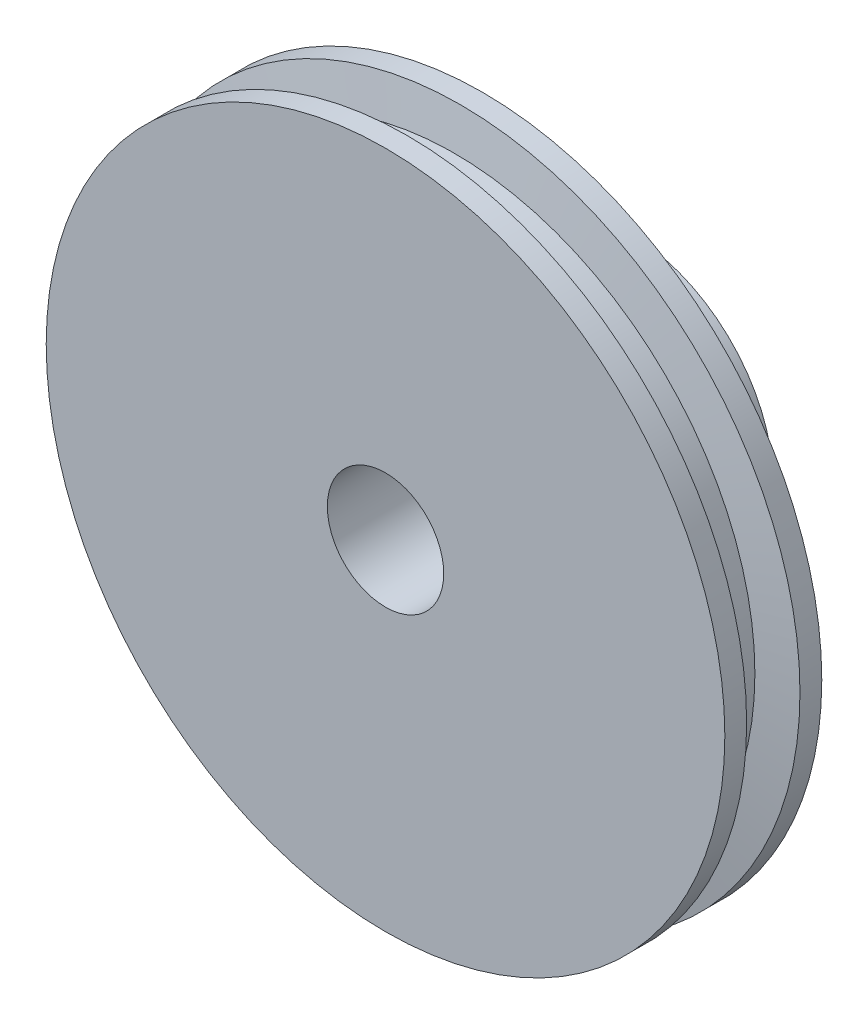
ISO-10303-21;
HEADER;
FILE_DESCRIPTION(('STEP AP214'),'2;1');
FILE_NAME('part.step','',(''),(''),'','','');
FILE_SCHEMA(('AUTOMOTIVE_DESIGN { 1 0 10303 214 1 1 1 1 }'));
ENDSEC;
DATA;
#1=APPLICATION_CONTEXT('core data for automotive mechanical design processes');
#2=APPLICATION_PROTOCOL_DEFINITION('international standard','automotive_design',2000,#1);
#3=PRODUCT_CONTEXT('',#1,'mechanical');
#4=PRODUCT('Part','Part','',(#3));
#5=PRODUCT_RELATED_PRODUCT_CATEGORY('part','',(#4));
#6=PRODUCT_DEFINITION_FORMATION('','',#4);
#7=PRODUCT_DEFINITION_CONTEXT('part definition',#1,'design');
#8=PRODUCT_DEFINITION('design','',#6,#7);
#9=PRODUCT_DEFINITION_SHAPE('','',#8);
#10=(LENGTH_UNIT() NAMED_UNIT(*) SI_UNIT(.MILLI.,.METRE.));
#11=(NAMED_UNIT(*) PLANE_ANGLE_UNIT() SI_UNIT($,.RADIAN.));
#12=(NAMED_UNIT(*) SI_UNIT($,.STERADIAN.) SOLID_ANGLE_UNIT());
#13=UNCERTAINTY_MEASURE_WITH_UNIT(LENGTH_MEASURE(1.E-05),#10,'distance_accuracy_value','');
#14=(GEOMETRIC_REPRESENTATION_CONTEXT(3) GLOBAL_UNCERTAINTY_ASSIGNED_CONTEXT((#13)) GLOBAL_UNIT_ASSIGNED_CONTEXT((#10,
#11,#12)) REPRESENTATION_CONTEXT('',''));
#15=CARTESIAN_POINT('',(0.,0.,0.));
#16=DIRECTION('',(0.,0.,1.));
#17=DIRECTION('',(1.,0.,0.));
#18=AXIS2_PLACEMENT_3D('',#15,#16,#17);
#19=CARTESIAN_POINT('',(0.,0.,10.));
#20=DIRECTION('',(0.,0.,-1.));
#21=DIRECTION('',(-1.,0.,0.));
#22=AXIS2_PLACEMENT_3D('',#19,#20,#21);
#23=CYLINDRICAL_SURFACE('',#22,35.);
#24=CARTESIAN_POINT('',(0.,0.,0.));
#25=DIRECTION('',(0.,0.,1.));
#26=DIRECTION('',(1.,0.,0.));
#27=AXIS2_PLACEMENT_3D('',#24,#25,#26);
#28=CIRCLE('',#27,35.);
#29=CARTESIAN_POINT('',(35.,0.,0.));
#30=VERTEX_POINT('',#29);
#31=EDGE_CURVE('E52',#30,#30,#28,.T.);
#32=ORIENTED_EDGE('',*,*,#31,.T.);
#33=EDGE_LOOP('',(#32));
#34=FACE_BOUND('',#33,.T.);
#35=CARTESIAN_POINT('',(0.,0.,2.25));
#36=DIRECTION('',(0.,0.,1.));
#37=DIRECTION('',(1.,0.,0.));
#38=AXIS2_PLACEMENT_3D('',#35,#36,#37);
#39=CIRCLE('',#38,35.);
#40=CARTESIAN_POINT('',(35.,0.,2.25));
#41=VERTEX_POINT('',#40);
#42=EDGE_CURVE('E84',#41,#41,#39,.T.);
#43=ORIENTED_EDGE('',*,*,#42,.F.);
#44=EDGE_LOOP('',(#43));
#45=FACE_BOUND('',#44,.T.);
#46=ADVANCED_FACE('F39',(#34,#45),#23,.T.);
#47=CARTESIAN_POINT('',(0.,0.,10.));
#48=DIRECTION('',(0.,0.,1.));
#49=DIRECTION('',(1.,0.,0.));
#50=AXIS2_PLACEMENT_3D('',#47,#48,#49);
#51=CIRCLE('',#50,35.);
#52=CARTESIAN_POINT('',(35.,0.,10.));
#53=VERTEX_POINT('',#52);
#54=EDGE_CURVE('E46',#53,#53,#51,.T.);
#55=ORIENTED_EDGE('',*,*,#54,.F.);
#56=EDGE_LOOP('',(#55));
#57=FACE_BOUND('',#56,.T.);
#58=CARTESIAN_POINT('',(0.,0.,7.75));
#59=DIRECTION('',(0.,0.,1.));
#60=DIRECTION('',(1.,0.,0.));
#61=AXIS2_PLACEMENT_3D('',#58,#59,#60);
#62=CIRCLE('',#61,35.);
#63=CARTESIAN_POINT('',(35.,0.,7.75));
#64=VERTEX_POINT('',#63);
#65=EDGE_CURVE('E80',#64,#64,#62,.T.);
#66=ORIENTED_EDGE('',*,*,#65,.T.);
#67=EDGE_LOOP('',(#66));
#68=FACE_BOUND('',#67,.T.);
#69=ADVANCED_FACE('F118',(#57,#68),#23,.T.);
#70=CARTESIAN_POINT('',(0.,0.,0.));
#71=DIRECTION('',(0.,0.,1.));
#72=DIRECTION('',(1.,0.,0.));
#73=AXIS2_PLACEMENT_3D('',#70,#71,#72);
#74=PLANE('',#73);
#75=ORIENTED_EDGE('',*,*,#31,.F.);
#76=EDGE_LOOP('',(#75));
#77=FACE_BOUND('',#76,.T.);
#78=CARTESIAN_POINT('',(0.,0.,0.));
#79=DIRECTION('',(0.,0.,1.));
#80=DIRECTION('',(1.,0.,0.));
#81=AXIS2_PLACEMENT_3D('',#78,#79,#80);
#82=CIRCLE('',#81,15.);
#83=CARTESIAN_POINT('',(15.,0.,0.));
#84=VERTEX_POINT('',#83);
#85=EDGE_CURVE('E10',#84,#84,#82,.F.);
#86=ORIENTED_EDGE('',*,*,#85,.F.);
#87=EDGE_LOOP('',(#86));
#88=FACE_BOUND('',#87,.T.);
#89=ADVANCED_FACE('F123',(#77,#88),#74,.F.);
#90=CARTESIAN_POINT('',(0.,0.,10.));
#91=DIRECTION('',(0.,0.,1.));
#92=DIRECTION('',(1.,0.,0.));
#93=AXIS2_PLACEMENT_3D('',#90,#91,#92);
#94=PLANE('',#93);
#95=ORIENTED_EDGE('',*,*,#54,.T.);
#96=EDGE_LOOP('',(#95));
#97=FACE_BOUND('',#96,.T.);
#98=CARTESIAN_POINT('',(0.,0.,10.));
#99=DIRECTION('',(0.,0.,1.));
#100=DIRECTION('',(1.,0.,0.));
#101=AXIS2_PLACEMENT_3D('',#98,#99,#100);
#102=CIRCLE('',#101,6.);
#103=CARTESIAN_POINT('',(6.,0.,10.));
#104=VERTEX_POINT('',#103);
#105=EDGE_CURVE('E59',#104,#104,#102,.T.);
#106=ORIENTED_EDGE('',*,*,#105,.F.);
#107=EDGE_LOOP('',(#106));
#108=FACE_BOUND('',#107,.T.);
#109=ADVANCED_FACE('F156',(#97,#108),#94,.T.);
#110=CARTESIAN_POINT('',(0.,0.,10.));
#111=DIRECTION('',(0.,0.,-1.));
#112=DIRECTION('',(-1.,0.,0.));
#113=AXIS2_PLACEMENT_3D('',#110,#111,#112);
#114=CYLINDRICAL_SURFACE('',#113,6.);
#115=CARTESIAN_POINT('',(0.,6.,-5.));
#116=CARTESIAN_POINT('',(-0.13390391816379,5.99999628290907,-5.00000471213959));
#117=CARTESIAN_POINT('',(-0.268039524991423,5.99546656821164,-5.01082131560053));
#118=CARTESIAN_POINT('',(-0.532498019991112,5.97780115788617,-5.05368073809364));
#119=CARTESIAN_POINT('',(-0.662810029808669,5.96464300599791,-5.08577894678153));
#120=CARTESIAN_POINT('',(-0.915376593299222,5.93112629106012,-5.1698214880593));
#121=CARTESIAN_POINT('',(-1.03765681434384,5.91079213642029,-5.2216985923231));
#122=CARTESIAN_POINT('',(-1.27165974779733,5.8649055925345,-5.34354583302187));
#123=CARTESIAN_POINT('',(-1.38338564416287,5.83935478441347,-5.41351048897477));
#124=CARTESIAN_POINT('',(-1.59889674004597,5.78415660619864,-5.57325791180755));
#125=CARTESIAN_POINT('',(-1.70208251703041,5.75437507703433,-5.66380260325171));
#126=CARTESIAN_POINT('',(-1.89231966019709,5.69465427085229,-5.86052868390046));
#127=CARTESIAN_POINT('',(-1.9793625312399,5.66471491925558,-5.96671825371509));
#128=CARTESIAN_POINT('',(-2.13907474876483,5.60642043928224,-6.19805355101054));
#129=CARTESIAN_POINT('',(-2.21082616169409,5.57821573827599,-6.32387489575144));
#130=CARTESIAN_POINT('',(-2.33187881316099,5.52871144633223,-6.58714651694295));
#131=CARTESIAN_POINT('',(-2.38119161708798,5.50740829980501,-6.72459075925711));
#132=CARTESIAN_POINT('',(-2.45349196589845,5.47557110795537,-7.00030738326152));
#133=CARTESIAN_POINT('',(-2.47763315746,5.46456775308952,-7.13822096671102));
#134=CARTESIAN_POINT('',(-2.50250419944797,5.45322652433634,-7.41654658544639));
#135=CARTESIAN_POINT('',(-2.50324696111169,5.45288276849133,-7.55695720007038));
#136=CARTESIAN_POINT('',(-2.48216900725154,5.46250239122986,-7.82480012085242));
#137=CARTESIAN_POINT('',(-2.46207362224013,5.47167765447589,-7.95240219312424));
#138=CARTESIAN_POINT('',(-2.40278382032141,5.4979696554725,-8.20222418200546));
#139=CARTESIAN_POINT('',(-2.36358574574512,5.51508791407035,-8.32444306298481));
#140=CARTESIAN_POINT('',(-2.26643917454979,5.55572369545608,-8.56311540598159));
#141=CARTESIAN_POINT('',(-2.20810943078428,5.57936963898298,-8.67939084182641));
#142=CARTESIAN_POINT('',(-2.07462485161168,5.63036662282147,-8.90095546776063));
#143=CARTESIAN_POINT('',(-1.99946338103921,5.65771912259552,-9.00624030122713));
#144=CARTESIAN_POINT('',(-1.82699193108754,5.71585953755966,-9.21219991746557));
#145=CARTESIAN_POINT('',(-1.72834696641501,5.74674242808948,-9.31173313477084));
#146=CARTESIAN_POINT('',(-1.51545918210305,5.80651346225057,-9.49322700591838));
#147=CARTESIAN_POINT('',(-1.40121271889692,5.83540113754019,-9.57518354338436));
#148=CARTESIAN_POINT('',(-1.15689589738674,5.88876567112947,-9.72087164723252));
#149=CARTESIAN_POINT('',(-1.02652116489535,5.91312533086667,-9.78413889030135));
#150=CARTESIAN_POINT('',(-0.755704805053663,5.95378962829607,-9.88744227920651));
#151=CARTESIAN_POINT('',(-0.615268789590069,5.970098716916,-9.92749126388763));
#152=CARTESIAN_POINT('',(-0.337856226692455,5.9919928237277,-9.98083198425327));
#153=CARTESIAN_POINT('',(-0.201222570557278,5.9981908209425,-9.99565571488749));
#154=CARTESIAN_POINT('',(0.0727093109921774,6.00112100737489,-10.0026924472282));
#155=CARTESIAN_POINT('',(0.21000733430527,5.99785591423878,-9.99491194050399));
#156=CARTESIAN_POINT('',(0.47419648468287,5.9826243531388,-9.95805783038786));
#157=CARTESIAN_POINT('',(0.601265933278774,5.97109774567979,-9.9300600918056));
#158=CARTESIAN_POINT('',(0.848765497942177,5.94097213544829,-9.85506361091842));
#159=CARTESIAN_POINT('',(0.969194773036712,5.92237223919408,-9.80806246809938));
#160=CARTESIAN_POINT('',(1.20421799973828,5.87916541290331,-9.69485804857577));
#161=CARTESIAN_POINT('',(1.31851447371068,5.85438982938561,-9.62810363370795));
#162=CARTESIAN_POINT('',(1.53469243246282,5.80147609158182,-9.47789324441658));
#163=CARTESIAN_POINT('',(1.63656870520375,5.77333653537473,-9.39443029694135));
#164=CARTESIAN_POINT('',(1.83266686054867,5.71424175790868,-9.20619353345529));
#165=CARTESIAN_POINT('',(1.92582139596022,5.68322903182029,-9.10032299402789));
#166=CARTESIAN_POINT('',(2.09333969221046,5.6236867353604,-8.87395744812879));
#167=CARTESIAN_POINT('',(2.16769918571026,5.59515772986988,-8.75345912965498));
#168=CARTESIAN_POINT('',(2.29631920417609,5.54362772487864,-8.49877164939642));
#169=CARTESIAN_POINT('',(2.3502783647545,5.52071125109803,-8.36441192897625));
#170=CARTESIAN_POINT('',(2.43434827902352,5.48416711318335,-8.08725881237388));
#171=CARTESIAN_POINT('',(2.46447869724417,5.47053179113073,-7.94447247501124));
#172=CARTESIAN_POINT('',(2.49808160700531,5.4552632907308,-7.66636260162194));
#173=CARTESIAN_POINT('',(2.50342760836083,5.45278701929114,-7.53131067548805));
#174=CARTESIAN_POINT('',(2.49231151038,5.45787706027259,-7.26231427764452));
#175=CARTESIAN_POINT('',(2.47585275892879,5.46544183100008,-7.1283696390999));
#176=CARTESIAN_POINT('',(2.42316809595844,5.48899102586044,-6.87181450532224));
#177=CARTESIAN_POINT('',(2.38789807270202,5.50456709625454,-6.74896665402247));
#178=CARTESIAN_POINT('',(2.29952656276962,5.54206362465905,-6.51090395633603));
#179=CARTESIAN_POINT('',(2.24642006560088,5.56398586515029,-6.39569126566399));
#180=CARTESIAN_POINT('',(2.1202057237392,5.61333908853254,-6.16860821185295));
#181=CARTESIAN_POINT('',(2.04608723750135,5.64102204404079,-6.05735535405219));
#182=CARTESIAN_POINT('',(1.88136812596238,5.69807379131314,-5.84827970688487));
#183=CARTESIAN_POINT('',(1.79076178563715,5.72744316520044,-5.75046159496759));
#184=CARTESIAN_POINT('',(1.58780416898837,5.78712781593092,-5.56370269438247));
#185=CARTESIAN_POINT('',(1.47434977868813,5.8173561917501,-5.47592735717221));
#186=CARTESIAN_POINT('',(1.23319985958042,5.87320303099822,-5.3206008699579));
#187=CARTESIAN_POINT('',(1.10549787741689,5.89881939160172,-5.25305893600317));
#188=CARTESIAN_POINT('',(0.84146521342219,5.94218308378896,-5.1415811295484));
#189=CARTESIAN_POINT('',(0.705312056415863,5.96005349044659,-5.09727350570993));
#190=CARTESIAN_POINT('',(0.426816782070265,5.9864223497589,-5.03258431247041));
#191=CARTESIAN_POINT('',(0.284495506121987,5.99495014042422,-5.01212783179418));
#192=CARTESIAN_POINT('',(0.118052512349435,5.99888566614292,-5.00267615821379));
#193=CARTESIAN_POINT('',(0.0944569348794004,5.99930292614998,-5.00167339749699));
#194=CARTESIAN_POINT('',(0.0472433090693345,5.99986042138656,-5.00033490174323));
#195=CARTESIAN_POINT('',(0.0236252606651497,6.0000006558228,-4.99999916861637));
#196=CARTESIAN_POINT('',(0.,6.,-5.));
#197=B_SPLINE_CURVE_WITH_KNOTS('',3,(#115,#116,#117,#118,#119,#120,#121,#122,#123,#124,#125,
#126,#127,#128,#129,#130,#131,#132,#133,#134,#135,#136,#137,#138,#139,#140,#141,#142,#143,#144,
#145,#146,#147,#148,#149,#150,#151,#152,#153,#154,#155,#156,#157,#158,#159,#160,#161,#162,#163,
#164,#165,#166,#167,#168,#169,#170,#171,#172,#173,#174,#175,#176,#177,#178,#179,#180,#181,#182,
#183,#184,#185,#186,#187,#188,#189,#190,#191,#192,#193,#194,#195,#196),.UNSPECIFIED.,.T.,.F.,(4,
2,2,2,2,2,2,2,2,2,2,2,2,2,2,2,2,2,2,2,2,2,2,2,2,2,2,2,2,2,2,2,2,2,2,2,2,2,2,2,4),(0.,
0.401613837767876,0.804277081257391,1.2055837038126,1.60676887370594,2.02635872577614,
2.4461687626293,2.8866344907825,3.32687293461175,3.74590546275114,4.16470676498091,
4.55140314405112,4.93817359454424,5.33317426117428,5.72833091434412,6.15688282255791,
6.58553498629174,7.02408110121625,7.46238448436592,7.872968867865,8.28343534986342,
8.67353179471441,9.06367753203568,9.4659427054432,9.8683761093899,10.2995697605859,
10.7308612248068,11.1682957671904,11.6053689414916,12.0087975511928,12.4121642259507,
12.7967529992952,13.1814498990122,13.5892778679488,13.9972474685189,14.4349307000978,
14.8728129885716,15.3034571163877,15.7327450093864,15.8036033125921,15.8744618187069),.UNSPECIFIED.);
#198=CARTESIAN_POINT('',(0.,6.,-5.));
#199=VERTEX_POINT('',#198);
#200=EDGE_CURVE('E97',#199,#199,#197,.T.);
#201=ORIENTED_EDGE('',*,*,#200,.F.);
#202=EDGE_LOOP('',(#201));
#203=FACE_BOUND('',#202,.T.);
#204=ORIENTED_EDGE('',*,*,#105,.T.);
#205=EDGE_LOOP('',(#204));
#206=FACE_BOUND('',#205,.T.);
#207=CARTESIAN_POINT('',(0.,0.,-15.));
#208=DIRECTION('',(0.,0.,-1.));
#209=DIRECTION('',(-1.,0.,0.));
#210=AXIS2_PLACEMENT_3D('',#207,#208,#209);
#211=CIRCLE('',#210,6.);
#212=CARTESIAN_POINT('',(-6.,0.,-15.));
#213=VERTEX_POINT('',#212);
#214=EDGE_CURVE('E68',#213,#213,#211,.T.);
#215=ORIENTED_EDGE('',*,*,#214,.T.);
#216=EDGE_LOOP('',(#215));
#217=FACE_BOUND('',#216,.T.);
#218=ADVANCED_FACE('F149',(#203,#206,#217),#114,.F.);
#219=CARTESIAN_POINT('',(0.,0.,-15.));
#220=DIRECTION('',(0.,0.,-1.));
#221=DIRECTION('',(-1.,0.,0.));
#222=AXIS2_PLACEMENT_3D('',#219,#220,#221);
#223=PLANE('',#222);
#224=CARTESIAN_POINT('',(0.,0.,-15.));
#225=DIRECTION('',(0.,0.,-1.));
#226=DIRECTION('',(-1.,0.,0.));
#227=AXIS2_PLACEMENT_3D('',#224,#225,#226);
#228=CIRCLE('',#227,15.);
#229=CARTESIAN_POINT('',(-15.,0.,-15.));
#230=VERTEX_POINT('',#229);
#231=EDGE_CURVE('E64',#230,#230,#228,.T.);
#232=ORIENTED_EDGE('',*,*,#231,.T.);
#233=EDGE_LOOP('',(#232));
#234=FACE_BOUND('',#233,.T.);
#235=ORIENTED_EDGE('',*,*,#214,.F.);
#236=EDGE_LOOP('',(#235));
#237=FACE_BOUND('',#236,.T.);
#238=ADVANCED_FACE('F146',(#234,#237),#223,.T.);
#239=CARTESIAN_POINT('',(0.,0.,-15.));
#240=DIRECTION('',(0.,0.,1.));
#241=DIRECTION('',(1.,0.,0.));
#242=AXIS2_PLACEMENT_3D('',#239,#240,#241);
#243=CYLINDRICAL_SURFACE('',#242,15.);
#244=CARTESIAN_POINT('',(0.,15.,-5.00000000000001));
#245=CARTESIAN_POINT('',(-0.139390904958214,14.9999976116882,-5.00000558894783));
#246=CARTESIAN_POINT('',(-0.27885788183882,14.9980367791303,-5.01169727496893));
#247=CARTESIAN_POINT('',(-0.553880221673041,14.9904034494139,-5.05813565876533));
#248=CARTESIAN_POINT('',(-0.689431867959244,14.9847275392389,-5.09290355691161));
#249=CARTESIAN_POINT('',(-0.95260474721264,14.9703006823645,-5.18441544859276));
#250=CARTESIAN_POINT('',(-1.0802323684319,14.9615522515919,-5.24114146564058));
#251=CARTESIAN_POINT('',(-1.32414184197794,14.9419422708207,-5.3749122920524));
#252=CARTESIAN_POINT('',(-1.44042498987859,14.9310809625443,-5.451954777483));
#253=CARTESIAN_POINT('',(-1.65947261429167,14.9083331745831,-5.62495508382047));
#254=CARTESIAN_POINT('',(-1.76211290353496,14.8964387181486,-5.72106911463614));
#255=CARTESIAN_POINT('',(-1.94988849865992,14.8730262687673,-5.92914796847282));
#256=CARTESIAN_POINT('',(-2.03502269939096,14.8615082996267,-6.04111379145662));
#257=CARTESIAN_POINT('',(-2.18586712560512,14.8400756575978,-6.27857096619706));
#258=CARTESIAN_POINT('',(-2.25145455286099,14.8301712909164,-6.40414133680476));
#259=CARTESIAN_POINT('',(-2.36055836541121,14.8131978979467,-6.66470956430063));
#260=CARTESIAN_POINT('',(-2.4040762415656,14.8061286801431,-6.79970678367763));
#261=CARTESIAN_POINT('',(-2.4674143777848,14.7957053684276,-7.07398027485654));
#262=CARTESIAN_POINT('',(-2.48744902913539,14.792317684857,-7.21320573650139));
#263=CARTESIAN_POINT('',(-2.50391672528987,14.7895393893665,-7.49308027688347));
#264=CARTESIAN_POINT('',(-2.50035144038899,14.7901484945721,-7.6337292541673));
#265=CARTESIAN_POINT('',(-2.46989509839614,14.7952642886356,-7.91092786127544));
#266=CARTESIAN_POINT('',(-2.44324488188976,14.7997307331892,-8.04750480354523));
#267=CARTESIAN_POINT('',(-2.36775314040344,14.8119949521101,-8.31422131782913));
#268=CARTESIAN_POINT('',(-2.31891085431973,14.8197928407327,-8.44436066888854));
#269=CARTESIAN_POINT('',(-2.2001772460939,14.837884793341,-8.69522882344091));
#270=CARTESIAN_POINT('',(-2.1301859138797,14.8481906710733,-8.81590940608122));
#271=CARTESIAN_POINT('',(-1.97121201755742,14.8701291841501,-9.04390440053838));
#272=CARTESIAN_POINT('',(-1.88222792065428,14.8817619265429,-9.15121773245493));
#273=CARTESIAN_POINT('',(-1.68648221215905,14.9052202787979,-9.35082608580734));
#274=CARTESIAN_POINT('',(-1.57951396387312,14.9170464923165,-9.44291851854008));
#275=CARTESIAN_POINT('',(-1.35153524898164,14.9394260139672,-9.60787776266533));
#276=CARTESIAN_POINT('',(-1.23052469190642,14.9499793138975,-9.68074445018322));
#277=CARTESIAN_POINT('',(-0.977705916166707,14.9686389289291,-9.80520222713627));
#278=CARTESIAN_POINT('',(-0.845888725564657,14.9767431840745,-9.85677541933125));
#279=CARTESIAN_POINT('',(-0.575298345602728,14.9895750301266,-9.93699421524597));
#280=CARTESIAN_POINT('',(-0.436525739179465,14.9943029035047,-9.96564173697371));
#281=CARTESIAN_POINT('',(-0.157709901301621,14.9998112984269,-9.99892135846112));
#282=CARTESIAN_POINT('',(-0.0177007371510091,15.0006375301278,-10.0038315718056));
#283=CARTESIAN_POINT('',(0.261139772889888,14.9983747442117,-9.99023865557187));
#284=CARTESIAN_POINT('',(0.399971163892038,14.9952858772412,-9.97173642686625));
#285=CARTESIAN_POINT('',(0.671656175546762,14.985568269382,-9.91207515066451));
#286=CARTESIAN_POINT('',(0.804540868385377,14.9789610480131,-9.87105379160986));
#287=CARTESIAN_POINT('',(1.06154688486044,14.9629446445536,-9.76766548180045));
#288=CARTESIAN_POINT('',(1.18566771590971,14.9535353051202,-9.70529733236472));
#289=CARTESIAN_POINT('',(1.42283068946895,14.9328451630241,-9.5603488753032));
#290=CARTESIAN_POINT('',(1.53576525093714,14.9215485588702,-9.47759484383274));
#291=CARTESIAN_POINT('',(1.74624358550268,14.898384673919,-9.29446268461493));
#292=CARTESIAN_POINT('',(1.84378623969658,14.8865173517155,-9.19408327672332));
#293=CARTESIAN_POINT('',(2.02174277965799,14.8634017523585,-8.97730245192857));
#294=CARTESIAN_POINT('',(2.10196876111371,14.8521611613711,-8.86074583448558));
#295=CARTESIAN_POINT('',(2.24170231029498,14.8317152977788,-8.61564703086146));
#296=CARTESIAN_POINT('',(2.30121053476981,14.8225099606602,-8.4871052247725));
#297=CARTESIAN_POINT('',(2.39753833147314,14.807234536977,-8.22221026718786));
#298=CARTESIAN_POINT('',(2.43445143254794,14.8011515431106,-8.08589190496951));
#299=CARTESIAN_POINT('',(2.48483545377827,14.7927771683526,-7.80887987077824));
#300=CARTESIAN_POINT('',(2.49830841194616,14.7904854578272,-7.66818658026795));
#301=CARTESIAN_POINT('',(2.50137286604734,14.7899673308401,-7.38829483403759));
#302=CARTESIAN_POINT('',(2.49126013612518,14.7916905650565,-7.24909962142471));
#303=CARTESIAN_POINT('',(2.44807983895684,14.7988978145373,-6.97442075194923));
#304=CARTESIAN_POINT('',(2.41501234611247,14.8043818176121,-6.83893708305813));
#305=CARTESIAN_POINT('',(2.32697448959489,14.8184735628172,-6.57564156270739));
#306=CARTESIAN_POINT('',(2.27202959060043,14.8270776721967,-6.44782098994398));
#307=CARTESIAN_POINT('',(2.1418270039159,14.8464436892221,-6.20316433080516));
#308=CARTESIAN_POINT('',(2.06656830874855,14.857205703884,-6.08632878962787));
#309=CARTESIAN_POINT('',(1.89681888437215,14.8798345404562,-5.86546441689225));
#310=CARTESIAN_POINT('',(1.80211056359364,14.891712955763,-5.76160398329973));
#311=CARTESIAN_POINT('',(1.59660903138022,14.9151437236084,-5.57114839552507));
#312=CARTESIAN_POINT('',(1.48581211291263,14.9266960002655,-5.48455723136184));
#313=CARTESIAN_POINT('',(1.25036916964028,14.9482652964222,-5.33055173180006));
#314=CARTESIAN_POINT('',(1.12563278753281,14.958271162531,-5.26327396068706));
#315=CARTESIAN_POINT('',(0.866513069378978,14.9755116760178,-5.15073051539009));
#316=CARTESIAN_POINT('',(0.732139494830007,14.9827490817748,-5.10544291892031));
#317=CARTESIAN_POINT('',(0.497703310045399,14.9920579083296,-5.04799472587334));
#318=CARTESIAN_POINT('',(0.399058830298446,14.9950202727336,-5.03002553038404));
#319=CARTESIAN_POINT('',(0.200289310319808,14.9989921598612,-5.00602626215526));
#320=CARTESIAN_POINT('',(0.100164295608494,15.0000017162064,-4.99999598386265));
#321=CARTESIAN_POINT('',(0.,15.,-5.00000000000001));
#322=B_SPLINE_CURVE_WITH_KNOTS('',3,(#244,#245,#246,#247,#248,#249,#250,#251,#252,#253,#254,
#255,#256,#257,#258,#259,#260,#261,#262,#263,#264,#265,#266,#267,#268,#269,#270,#271,#272,#273,
#274,#275,#276,#277,#278,#279,#280,#281,#282,#283,#284,#285,#286,#287,#288,#289,#290,#291,#292,
#293,#294,#295,#296,#297,#298,#299,#300,#301,#302,#303,#304,#305,#306,#307,#308,#309,#310,#311,
#312,#313,#314,#315,#316,#317,#318,#319,#320,#321),.UNSPECIFIED.,.T.,.F.,(4,2,2,2,2,2,2,2,2,2,2,
2,2,2,2,2,2,2,2,2,2,2,2,2,2,2,2,2,2,2,2,2,2,2,2,2,2,2,4),(0.,0.417806584938508,
0.835997545695417,1.25384686702527,1.67164841267478,2.09302491062331,2.51442800169856,
2.93842520823839,3.3623937687618,3.78246077103422,4.20249804320885,4.61820521760406,
5.03392665025379,5.45164556632555,5.86939820680571,6.29232769911324,6.71525991635845,
7.13854688915901,7.56179844521146,7.98007883491394,8.39834313035857,8.81407807006412,
9.22983635826063,9.6492682562702,10.0687306305428,10.4925382200761,10.9163323737594,
11.3383602234177,11.7603513778661,12.177079095227,12.5938054618813,13.0100481822622,
13.4263115502933,13.8475138419339,14.2688133387897,14.6930223160719,15.1168075213007,
15.4170424816401,15.7172722727696),.UNSPECIFIED.);
#323=CARTESIAN_POINT('',(0.,15.,-5.00000000000001));
#324=VERTEX_POINT('',#323);
#325=EDGE_CURVE('E88',#324,#324,#322,.T.);
#326=ORIENTED_EDGE('',*,*,#325,.T.);
#327=EDGE_LOOP('',(#326));
#328=FACE_BOUND('',#327,.T.);
#329=ORIENTED_EDGE('',*,*,#231,.F.);
#330=EDGE_LOOP('',(#329));
#331=FACE_BOUND('',#330,.T.);
#332=ORIENTED_EDGE('',*,*,#85,.T.);
#333=EDGE_LOOP('',(#332));
#334=FACE_BOUND('',#333,.T.);
#335=ADVANCED_FACE('F132',(#328,#331,#334),#243,.T.);
#336=CARTESIAN_POINT('',(0.,0.,2.9));
#337=DIRECTION('',(0.,0.,-1.));
#338=DIRECTION('',(-1.,0.,0.));
#339=AXIS2_PLACEMENT_3D('',#336,#337,#338);
#340=CONICAL_SURFACE('',#339,31.,1.40970442225732);
#341=ORIENTED_EDGE('',*,*,#42,.T.);
#342=EDGE_LOOP('',(#341));
#343=FACE_BOUND('',#342,.T.);
#344=CARTESIAN_POINT('',(0.,0.,2.9));
#345=DIRECTION('',(0.,0.,1.));
#346=DIRECTION('',(1.,0.,0.));
#347=AXIS2_PLACEMENT_3D('',#344,#345,#346);
#348=CIRCLE('',#347,31.);
#349=CARTESIAN_POINT('',(31.,0.,2.9));
#350=VERTEX_POINT('',#349);
#351=EDGE_CURVE('E72',#350,#350,#348,.T.);
#352=ORIENTED_EDGE('',*,*,#351,.F.);
#353=EDGE_LOOP('',(#352));
#354=FACE_BOUND('',#353,.T.);
#355=ADVANCED_FACE('F129',(#343,#354),#340,.T.);
#356=CARTESIAN_POINT('',(0.,0.,0.));
#357=DIRECTION('',(0.,0.,1.));
#358=DIRECTION('',(1.,0.,0.));
#359=AXIS2_PLACEMENT_3D('',#356,#357,#358);
#360=CYLINDRICAL_SURFACE('',#359,31.);
#361=ORIENTED_EDGE('',*,*,#351,.T.);
#362=EDGE_LOOP('',(#361));
#363=FACE_BOUND('',#362,.T.);
#364=CARTESIAN_POINT('',(0.,0.,7.1));
#365=DIRECTION('',(0.,0.,1.));
#366=DIRECTION('',(1.,0.,0.));
#367=AXIS2_PLACEMENT_3D('',#364,#365,#366);
#368=CIRCLE('',#367,31.);
#369=CARTESIAN_POINT('',(31.,0.,7.1));
#370=VERTEX_POINT('',#369);
#371=EDGE_CURVE('E76',#370,#370,#368,.T.);
#372=ORIENTED_EDGE('',*,*,#371,.F.);
#373=EDGE_LOOP('',(#372));
#374=FACE_BOUND('',#373,.T.);
#375=ADVANCED_FACE('F113',(#363,#374),#360,.T.);
#376=CARTESIAN_POINT('',(0.,0.,7.75));
#377=DIRECTION('',(0.,0.,1.));
#378=DIRECTION('',(1.,0.,0.));
#379=AXIS2_PLACEMENT_3D('',#376,#377,#378);
#380=CONICAL_SURFACE('',#379,35.,1.40970442225732);
#381=ORIENTED_EDGE('',*,*,#371,.T.);
#382=EDGE_LOOP('',(#381));
#383=FACE_BOUND('',#382,.T.);
#384=ORIENTED_EDGE('',*,*,#65,.F.);
#385=EDGE_LOOP('',(#384));
#386=FACE_BOUND('',#385,.T.);
#387=ADVANCED_FACE('F107',(#383,#386),#380,.T.);
#388=CARTESIAN_POINT('',(0.,7.5,-7.5));
#389=DIRECTION('',(0.,1.,0.));
#390=DIRECTION('',(0.,0.,1.));
#391=AXIS2_PLACEMENT_3D('',#388,#389,#390);
#392=CYLINDRICAL_SURFACE('',#391,2.49999999999999);
#393=ORIENTED_EDGE('',*,*,#325,.F.);
#394=EDGE_LOOP('',(#393));
#395=FACE_BOUND('',#394,.T.);
#396=ORIENTED_EDGE('',*,*,#200,.T.);
#397=EDGE_LOOP('',(#396));
#398=FACE_BOUND('',#397,.T.);
#399=ADVANCED_FACE('F104',(#395,#398),#392,.F.);
#400=CLOSED_SHELL('',(#46,#69,#89,#109,#218,#238,#335,#355,#375,#387,#399));
#401=MANIFOLD_SOLID_BREP('B2',#400);
#402=ADVANCED_BREP_SHAPE_REPRESENTATION('',(#18,#401),#14);
#403=SHAPE_DEFINITION_REPRESENTATION(#9,#402);
ENDSEC;
END-ISO-10303-21;
